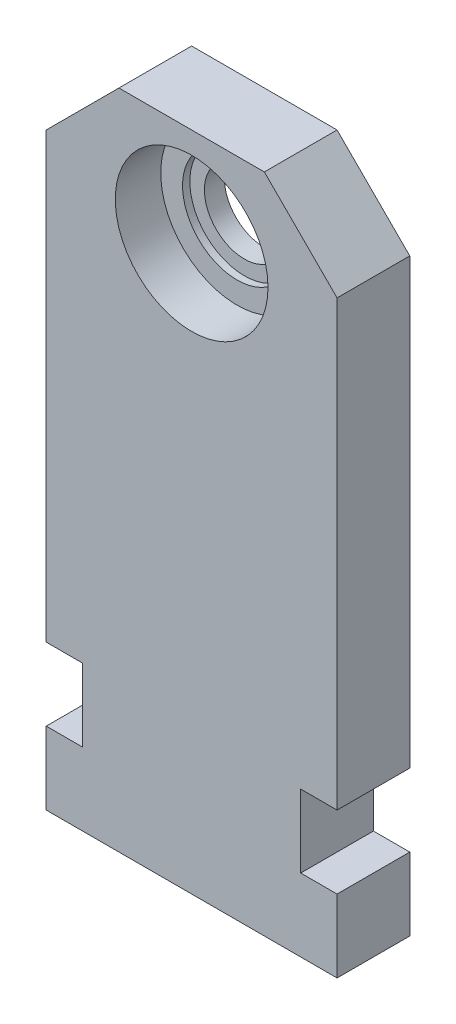
ISO-10303-21;
HEADER;
FILE_DESCRIPTION(('STEP AP214'),'2;1');
FILE_NAME('part.step','',(''),(''),'','','');
FILE_SCHEMA(('AUTOMOTIVE_DESIGN { 1 0 10303 214 1 1 1 1 }'));
ENDSEC;
DATA;
#1=APPLICATION_CONTEXT('core data for automotive mechanical design processes');
#2=APPLICATION_PROTOCOL_DEFINITION('international standard','automotive_design',2000,#1);
#3=PRODUCT_CONTEXT('',#1,'mechanical');
#4=PRODUCT('Part','Part','',(#3));
#5=PRODUCT_RELATED_PRODUCT_CATEGORY('part','',(#4));
#6=PRODUCT_DEFINITION_FORMATION('','',#4);
#7=PRODUCT_DEFINITION_CONTEXT('part definition',#1,'design');
#8=PRODUCT_DEFINITION('design','',#6,#7);
#9=PRODUCT_DEFINITION_SHAPE('','',#8);
#10=(LENGTH_UNIT() NAMED_UNIT(*) SI_UNIT(.MILLI.,.METRE.));
#11=(NAMED_UNIT(*) PLANE_ANGLE_UNIT() SI_UNIT($,.RADIAN.));
#12=(NAMED_UNIT(*) SI_UNIT($,.STERADIAN.) SOLID_ANGLE_UNIT());
#13=UNCERTAINTY_MEASURE_WITH_UNIT(LENGTH_MEASURE(1.E-05),#10,'distance_accuracy_value','');
#14=(GEOMETRIC_REPRESENTATION_CONTEXT(3) GLOBAL_UNCERTAINTY_ASSIGNED_CONTEXT((#13)) GLOBAL_UNIT_ASSIGNED_CONTEXT((#10,
#11,#12)) REPRESENTATION_CONTEXT('',''));
#15=CARTESIAN_POINT('',(0.,0.,0.));
#16=DIRECTION('',(0.,0.,1.));
#17=DIRECTION('',(1.,0.,0.));
#18=AXIS2_PLACEMENT_3D('',#15,#16,#17);
#19=CARTESIAN_POINT('',(0.,0.,20.));
#20=DIRECTION('',(1.,0.,0.));
#21=DIRECTION('',(0.,0.,-1.));
#22=AXIS2_PLACEMENT_3D('',#19,#20,#21);
#23=PLANE('',#22);
#24=DIRECTION('',(0.,-1.,0.));
#25=VECTOR('',#24,1.);
#26=CARTESIAN_POINT('',(0.,0.,20.));
#27=LINE('',#26,#25);
#28=CARTESIAN_POINT('',(0.,20.,20.));
#29=VERTEX_POINT('',#28);
#30=CARTESIAN_POINT('',(0.,0.,20.));
#31=VERTEX_POINT('',#30);
#32=EDGE_CURVE('E171',#29,#31,#27,.T.);
#33=ORIENTED_EDGE('',*,*,#32,.F.);
#34=DIRECTION('',(0.,0.,1.));
#35=VECTOR('',#34,1.);
#36=CARTESIAN_POINT('',(0.,20.,0.));
#37=LINE('',#36,#35);
#38=CARTESIAN_POINT('',(0.,20.,0.));
#39=VERTEX_POINT('',#38);
#40=EDGE_CURVE('E143',#39,#29,#37,.T.);
#41=ORIENTED_EDGE('',*,*,#40,.F.);
#42=DIRECTION('',(0.,-1.,0.));
#43=VECTOR('',#42,1.);
#44=CARTESIAN_POINT('',(0.,0.,0.));
#45=LINE('',#44,#43);
#46=CARTESIAN_POINT('',(0.,0.,0.));
#47=VERTEX_POINT('',#46);
#48=EDGE_CURVE('E244',#39,#47,#45,.T.);
#49=ORIENTED_EDGE('',*,*,#48,.T.);
#50=DIRECTION('',(0.,0.,-1.));
#51=VECTOR('',#50,1.);
#52=CARTESIAN_POINT('',(0.,0.,20.));
#53=LINE('',#52,#51);
#54=EDGE_CURVE('E175',#31,#47,#53,.T.);
#55=ORIENTED_EDGE('',*,*,#54,.F.);
#56=EDGE_LOOP('',(#33,#41,#49,#55));
#57=FACE_BOUND('',#56,.T.);
#58=ADVANCED_FACE('F32',(#57),#23,.F.);
#59=CARTESIAN_POINT('',(80.,0.,20.));
#60=DIRECTION('',(-1.,0.,0.));
#61=DIRECTION('',(0.,0.,1.));
#62=AXIS2_PLACEMENT_3D('',#59,#60,#61);
#63=PLANE('',#62);
#64=DIRECTION('',(0.,1.,0.));
#65=VECTOR('',#64,1.);
#66=CARTESIAN_POINT('',(80.,0.,0.));
#67=LINE('',#66,#65);
#68=CARTESIAN_POINT('',(80.,0.,0.));
#69=VERTEX_POINT('',#68);
#70=CARTESIAN_POINT('',(80.,20.,0.));
#71=VERTEX_POINT('',#70);
#72=EDGE_CURVE('E160',#69,#71,#67,.T.);
#73=ORIENTED_EDGE('',*,*,#72,.T.);
#74=DIRECTION('',(0.,0.,1.));
#75=VECTOR('',#74,1.);
#76=CARTESIAN_POINT('',(80.,20.,0.));
#77=LINE('',#76,#75);
#78=CARTESIAN_POINT('',(80.,20.,20.));
#79=VERTEX_POINT('',#78);
#80=EDGE_CURVE('E283',#71,#79,#77,.T.);
#81=ORIENTED_EDGE('',*,*,#80,.T.);
#82=DIRECTION('',(0.,1.,0.));
#83=VECTOR('',#82,1.);
#84=CARTESIAN_POINT('',(80.,0.,20.));
#85=LINE('',#84,#83);
#86=CARTESIAN_POINT('',(80.,0.,20.));
#87=VERTEX_POINT('',#86);
#88=EDGE_CURVE('E203',#87,#79,#85,.T.);
#89=ORIENTED_EDGE('',*,*,#88,.F.);
#90=DIRECTION('',(0.,0.,-1.));
#91=VECTOR('',#90,1.);
#92=CARTESIAN_POINT('',(80.,0.,20.));
#93=LINE('',#92,#91);
#94=EDGE_CURVE('E172',#87,#69,#93,.T.);
#95=ORIENTED_EDGE('',*,*,#94,.T.);
#96=EDGE_LOOP('',(#73,#81,#89,#95));
#97=FACE_BOUND('',#96,.T.);
#98=ADVANCED_FACE('F216',(#97),#63,.F.);
#99=CARTESIAN_POINT('',(40.,155.,0.));
#100=DIRECTION('',(0.,0.,1.));
#101=DIRECTION('',(1.,0.,0.));
#102=AXIS2_PLACEMENT_3D('',#99,#100,#101);
#103=CYLINDRICAL_SURFACE('',#102,11.);
#104=CARTESIAN_POINT('',(40.,155.,0.));
#105=DIRECTION('',(0.,0.,1.));
#106=DIRECTION('',(1.,0.,0.));
#107=AXIS2_PLACEMENT_3D('',#104,#105,#106);
#108=CIRCLE('',#107,11.);
#109=CARTESIAN_POINT('',(51.,155.,0.));
#110=VERTEX_POINT('',#109);
#111=EDGE_CURVE('E245',#110,#110,#108,.T.);
#112=ORIENTED_EDGE('',*,*,#111,.F.);
#113=EDGE_LOOP('',(#112));
#114=FACE_BOUND('',#113,.T.);
#115=CARTESIAN_POINT('',(40.,155.,5.5));
#116=DIRECTION('',(0.,0.,1.));
#117=DIRECTION('',(1.,0.,0.));
#118=AXIS2_PLACEMENT_3D('',#115,#116,#117);
#119=CIRCLE('',#118,11.);
#120=CARTESIAN_POINT('',(51.,155.,5.5));
#121=VERTEX_POINT('',#120);
#122=EDGE_CURVE('E36',#121,#121,#119,.F.);
#123=ORIENTED_EDGE('',*,*,#122,.F.);
#124=EDGE_LOOP('',(#123));
#125=FACE_BOUND('',#124,.T.);
#126=ADVANCED_FACE('F222',(#114,#125),#103,.F.);
#127=CARTESIAN_POINT('',(0.,162.,0.));
#128=VERTEX_POINT('',#127);
#129=CARTESIAN_POINT('',(0.,40.,0.));
#130=VERTEX_POINT('',#129);
#131=EDGE_CURVE('E165',#128,#130,#45,.T.);
#132=ORIENTED_EDGE('',*,*,#131,.T.);
#133=DIRECTION('',(0.,0.,1.));
#134=VECTOR('',#133,1.);
#135=CARTESIAN_POINT('',(0.,40.,0.));
#136=LINE('',#135,#134);
#137=CARTESIAN_POINT('',(0.,40.,20.));
#138=VERTEX_POINT('',#137);
#139=EDGE_CURVE('E241',#130,#138,#136,.T.);
#140=ORIENTED_EDGE('',*,*,#139,.T.);
#141=CARTESIAN_POINT('',(0.,162.,20.));
#142=VERTEX_POINT('',#141);
#143=EDGE_CURVE('E250',#142,#138,#27,.T.);
#144=ORIENTED_EDGE('',*,*,#143,.F.);
#145=DIRECTION('',(0.,0.,-1.));
#146=VECTOR('',#145,1.);
#147=CARTESIAN_POINT('',(0.,162.,20.));
#148=LINE('',#147,#146);
#149=EDGE_CURVE('E11',#142,#128,#148,.T.);
#150=ORIENTED_EDGE('',*,*,#149,.T.);
#151=EDGE_LOOP('',(#132,#140,#144,#150));
#152=FACE_BOUND('',#151,.T.);
#153=ADVANCED_FACE('F218',(#152),#23,.F.);
#154=CARTESIAN_POINT('',(0.,0.,20.));
#155=DIRECTION('',(0.,1.,0.));
#156=DIRECTION('',(0.,0.,1.));
#157=AXIS2_PLACEMENT_3D('',#154,#155,#156);
#158=PLANE('',#157);
#159=DIRECTION('',(1.,0.,0.));
#160=VECTOR('',#159,1.);
#161=CARTESIAN_POINT('',(0.,0.,0.));
#162=LINE('',#161,#160);
#163=EDGE_CURVE('E161',#47,#69,#162,.T.);
#164=ORIENTED_EDGE('',*,*,#163,.T.);
#165=ORIENTED_EDGE('',*,*,#94,.F.);
#166=DIRECTION('',(1.,0.,0.));
#167=VECTOR('',#166,1.);
#168=CARTESIAN_POINT('',(0.,0.,20.));
#169=LINE('',#168,#167);
#170=EDGE_CURVE('E248',#31,#87,#169,.T.);
#171=ORIENTED_EDGE('',*,*,#170,.F.);
#172=ORIENTED_EDGE('',*,*,#54,.T.);
#173=EDGE_LOOP('',(#164,#165,#171,#172));
#174=FACE_BOUND('',#173,.T.);
#175=ADVANCED_FACE('F228',(#174),#158,.F.);
#176=CARTESIAN_POINT('',(80.,40.,20.));
#177=VERTEX_POINT('',#176);
#178=CARTESIAN_POINT('',(80.,162.,20.));
#179=VERTEX_POINT('',#178);
#180=EDGE_CURVE('E151',#177,#179,#85,.T.);
#181=ORIENTED_EDGE('',*,*,#180,.F.);
#182=DIRECTION('',(0.,0.,1.));
#183=VECTOR('',#182,1.);
#184=CARTESIAN_POINT('',(80.,40.,0.));
#185=LINE('',#184,#183);
#186=CARTESIAN_POINT('',(80.,40.,0.));
#187=VERTEX_POINT('',#186);
#188=EDGE_CURVE('E138',#187,#177,#185,.T.);
#189=ORIENTED_EDGE('',*,*,#188,.F.);
#190=CARTESIAN_POINT('',(80.,162.,0.));
#191=VERTEX_POINT('',#190);
#192=EDGE_CURVE('E149',#187,#191,#67,.T.);
#193=ORIENTED_EDGE('',*,*,#192,.T.);
#194=DIRECTION('',(0.,0.,1.));
#195=VECTOR('',#194,1.);
#196=CARTESIAN_POINT('',(80.,162.,20.));
#197=LINE('',#196,#195);
#198=EDGE_CURVE('E187',#191,#179,#197,.T.);
#199=ORIENTED_EDGE('',*,*,#198,.T.);
#200=EDGE_LOOP('',(#181,#189,#193,#199));
#201=FACE_BOUND('',#200,.T.);
#202=ADVANCED_FACE('F147',(#201),#63,.F.);
#203=CARTESIAN_POINT('',(0.,182.,20.));
#204=DIRECTION('',(0.,-1.,0.));
#205=DIRECTION('',(0.,0.,-1.));
#206=AXIS2_PLACEMENT_3D('',#203,#204,#205);
#207=PLANE('',#206);
#208=DIRECTION('',(-1.,0.,0.));
#209=VECTOR('',#208,1.);
#210=CARTESIAN_POINT('',(0.,182.,20.));
#211=LINE('',#210,#209);
#212=CARTESIAN_POINT('',(60.,182.,20.));
#213=VERTEX_POINT('',#212);
#214=CARTESIAN_POINT('',(20.0000000000001,182.,20.));
#215=VERTEX_POINT('',#214);
#216=EDGE_CURVE('E176',#213,#215,#211,.T.);
#217=ORIENTED_EDGE('',*,*,#216,.F.);
#218=DIRECTION('',(0.,0.,-1.));
#219=VECTOR('',#218,1.);
#220=CARTESIAN_POINT('',(60.,182.,20.));
#221=LINE('',#220,#219);
#222=CARTESIAN_POINT('',(60.,182.,0.));
#223=VERTEX_POINT('',#222);
#224=EDGE_CURVE('E181',#213,#223,#221,.T.);
#225=ORIENTED_EDGE('',*,*,#224,.T.);
#226=DIRECTION('',(-1.,0.,0.));
#227=VECTOR('',#226,1.);
#228=CARTESIAN_POINT('',(0.,182.,0.));
#229=LINE('',#228,#227);
#230=CARTESIAN_POINT('',(20.0000000000001,182.,0.));
#231=VERTEX_POINT('',#230);
#232=EDGE_CURVE('E164',#223,#231,#229,.T.);
#233=ORIENTED_EDGE('',*,*,#232,.T.);
#234=DIRECTION('',(0.,0.,1.));
#235=VECTOR('',#234,1.);
#236=CARTESIAN_POINT('',(20.0000000000001,182.,20.));
#237=LINE('',#236,#235);
#238=EDGE_CURVE('E179',#231,#215,#237,.T.);
#239=ORIENTED_EDGE('',*,*,#238,.T.);
#240=EDGE_LOOP('',(#217,#225,#233,#239));
#241=FACE_BOUND('',#240,.T.);
#242=ADVANCED_FACE('F201',(#241),#207,.F.);
#243=CARTESIAN_POINT('',(0.,0.,20.));
#244=DIRECTION('',(0.,0.,-1.));
#245=DIRECTION('',(-1.,0.,0.));
#246=AXIS2_PLACEMENT_3D('',#243,#244,#245);
#247=PLANE('',#246);
#248=CARTESIAN_POINT('',(40.,155.,20.));
#249=DIRECTION('',(0.,0.,1.));
#250=DIRECTION('',(1.,0.,0.));
#251=AXIS2_PLACEMENT_3D('',#248,#249,#250);
#252=CIRCLE('',#251,21.);
#253=CARTESIAN_POINT('',(61.,155.,20.));
#254=VERTEX_POINT('',#253);
#255=EDGE_CURVE('E255',#254,#254,#252,.T.);
#256=ORIENTED_EDGE('',*,*,#255,.F.);
#257=EDGE_LOOP('',(#256));
#258=FACE_BOUND('',#257,.T.);
#259=ORIENTED_EDGE('',*,*,#88,.T.);
#260=DIRECTION('',(-1.,0.,0.));
#261=VECTOR('',#260,1.);
#262=CARTESIAN_POINT('',(0.,20.,20.));
#263=LINE('',#262,#261);
#264=CARTESIAN_POINT('',(70.,20.,20.));
#265=VERTEX_POINT('',#264);
#266=EDGE_CURVE('E264',#79,#265,#263,.T.);
#267=ORIENTED_EDGE('',*,*,#266,.T.);
#268=DIRECTION('',(0.,1.,0.));
#269=VECTOR('',#268,1.);
#270=CARTESIAN_POINT('',(70.,0.,20.));
#271=LINE('',#270,#269);
#272=CARTESIAN_POINT('',(70.,40.,20.));
#273=VERTEX_POINT('',#272);
#274=EDGE_CURVE('E269',#265,#273,#271,.T.);
#275=ORIENTED_EDGE('',*,*,#274,.T.);
#276=DIRECTION('',(1.,0.,0.));
#277=VECTOR('',#276,1.);
#278=CARTESIAN_POINT('',(0.,40.,20.));
#279=LINE('',#278,#277);
#280=EDGE_CURVE('E272',#273,#177,#279,.T.);
#281=ORIENTED_EDGE('',*,*,#280,.T.);
#282=ORIENTED_EDGE('',*,*,#180,.T.);
#283=DIRECTION('',(0.707106781186547,-0.707106781186549,0.));
#284=VECTOR('',#283,1.);
#285=CARTESIAN_POINT('',(60.,182.,20.));
#286=LINE('',#285,#284);
#287=EDGE_CURVE('E41',#179,#213,#286,.F.);
#288=ORIENTED_EDGE('',*,*,#287,.T.);
#289=ORIENTED_EDGE('',*,*,#216,.T.);
#290=DIRECTION('',(0.707106781186549,0.707106781186546,0.));
#291=VECTOR('',#290,1.);
#292=CARTESIAN_POINT('',(0.,162.,20.));
#293=LINE('',#292,#291);
#294=EDGE_CURVE('E189',#215,#142,#293,.F.);
#295=ORIENTED_EDGE('',*,*,#294,.T.);
#296=ORIENTED_EDGE('',*,*,#143,.T.);
#297=DIRECTION('',(1.,0.,0.));
#298=VECTOR('',#297,1.);
#299=CARTESIAN_POINT('',(0.,40.,20.));
#300=LINE('',#299,#298);
#301=CARTESIAN_POINT('',(9.99999999999999,40.,20.));
#302=VERTEX_POINT('',#301);
#303=EDGE_CURVE('E277',#138,#302,#300,.T.);
#304=ORIENTED_EDGE('',*,*,#303,.T.);
#305=DIRECTION('',(0.,-1.,0.));
#306=VECTOR('',#305,1.);
#307=CARTESIAN_POINT('',(9.99999999999999,0.,20.));
#308=LINE('',#307,#306);
#309=CARTESIAN_POINT('',(9.99999999999999,20.,20.));
#310=VERTEX_POINT('',#309);
#311=EDGE_CURVE('E280',#302,#310,#308,.T.);
#312=ORIENTED_EDGE('',*,*,#311,.T.);
#313=DIRECTION('',(-1.,0.,0.));
#314=VECTOR('',#313,1.);
#315=CARTESIAN_POINT('',(0.,20.,20.));
#316=LINE('',#315,#314);
#317=EDGE_CURVE('E274',#310,#29,#316,.T.);
#318=ORIENTED_EDGE('',*,*,#317,.T.);
#319=ORIENTED_EDGE('',*,*,#32,.T.);
#320=ORIENTED_EDGE('',*,*,#170,.T.);
#321=EDGE_LOOP('',(#259,#267,#275,#281,#282,#288,#289,#295,#296,#304,#312,#318,#319,#320));
#322=FACE_BOUND('',#321,.T.);
#323=ADVANCED_FACE('F196',(#258,#322),#247,.F.);
#324=CARTESIAN_POINT('',(0.,0.,0.));
#325=DIRECTION('',(0.,0.,-1.));
#326=DIRECTION('',(-1.,0.,0.));
#327=AXIS2_PLACEMENT_3D('',#324,#325,#326);
#328=PLANE('',#327);
#329=DIRECTION('',(1.,0.,0.));
#330=VECTOR('',#329,1.);
#331=CARTESIAN_POINT('',(80.,20.,0.));
#332=LINE('',#331,#330);
#333=CARTESIAN_POINT('',(70.,20.,0.));
#334=VERTEX_POINT('',#333);
#335=EDGE_CURVE('E152',#334,#71,#332,.T.);
#336=ORIENTED_EDGE('',*,*,#335,.T.);
#337=ORIENTED_EDGE('',*,*,#72,.F.);
#338=ORIENTED_EDGE('',*,*,#163,.F.);
#339=ORIENTED_EDGE('',*,*,#48,.F.);
#340=DIRECTION('',(1.,0.,0.));
#341=VECTOR('',#340,1.);
#342=CARTESIAN_POINT('',(0.,20.,0.));
#343=LINE('',#342,#341);
#344=CARTESIAN_POINT('',(9.99999999999999,20.,0.));
#345=VERTEX_POINT('',#344);
#346=EDGE_CURVE('E295',#39,#345,#343,.T.);
#347=ORIENTED_EDGE('',*,*,#346,.T.);
#348=DIRECTION('',(0.,1.,0.));
#349=VECTOR('',#348,1.);
#350=CARTESIAN_POINT('',(9.99999999999999,20.,0.));
#351=LINE('',#350,#349);
#352=CARTESIAN_POINT('',(9.99999999999999,40.,0.));
#353=VERTEX_POINT('',#352);
#354=EDGE_CURVE('E292',#345,#353,#351,.T.);
#355=ORIENTED_EDGE('',*,*,#354,.T.);
#356=DIRECTION('',(-1.,0.,0.));
#357=VECTOR('',#356,1.);
#358=CARTESIAN_POINT('',(0.,40.,0.));
#359=LINE('',#358,#357);
#360=EDGE_CURVE('E56',#353,#130,#359,.T.);
#361=ORIENTED_EDGE('',*,*,#360,.T.);
#362=ORIENTED_EDGE('',*,*,#131,.F.);
#363=DIRECTION('',(-0.707106781186549,-0.707106781186546,0.));
#364=VECTOR('',#363,1.);
#365=CARTESIAN_POINT('',(-81.,81.0000000000004,0.));
#366=LINE('',#365,#364);
#367=EDGE_CURVE('E184',#128,#231,#366,.F.);
#368=ORIENTED_EDGE('',*,*,#367,.T.);
#369=ORIENTED_EDGE('',*,*,#232,.F.);
#370=DIRECTION('',(-0.707106781186547,0.707106781186549,0.));
#371=VECTOR('',#370,1.);
#372=CARTESIAN_POINT('',(121.,121.,0.));
#373=LINE('',#372,#371);
#374=EDGE_CURVE('E158',#223,#191,#373,.F.);
#375=ORIENTED_EDGE('',*,*,#374,.T.);
#376=ORIENTED_EDGE('',*,*,#192,.F.);
#377=DIRECTION('',(-1.,0.,0.));
#378=VECTOR('',#377,1.);
#379=CARTESIAN_POINT('',(80.,40.,0.));
#380=LINE('',#379,#378);
#381=CARTESIAN_POINT('',(70.,40.,0.));
#382=VERTEX_POINT('',#381);
#383=EDGE_CURVE('E135',#187,#382,#380,.T.);
#384=ORIENTED_EDGE('',*,*,#383,.T.);
#385=DIRECTION('',(0.,-1.,0.));
#386=VECTOR('',#385,1.);
#387=CARTESIAN_POINT('',(70.,20.,0.));
#388=LINE('',#387,#386);
#389=EDGE_CURVE('E48',#382,#334,#388,.T.);
#390=ORIENTED_EDGE('',*,*,#389,.T.);
#391=EDGE_LOOP('',(#336,#337,#338,#339,#347,#355,#361,#362,#368,#369,#375,#376,#384,#390));
#392=FACE_BOUND('',#391,.T.);
#393=ORIENTED_EDGE('',*,*,#111,.T.);
#394=EDGE_LOOP('',(#393));
#395=FACE_BOUND('',#394,.T.);
#396=ADVANCED_FACE('F155',(#392,#395),#328,.T.);
#397=CARTESIAN_POINT('',(60.,182.,20.));
#398=DIRECTION('',(-0.707106781186549,-0.707106781186547,0.));
#399=DIRECTION('',(0.,0.,-1.));
#400=AXIS2_PLACEMENT_3D('',#397,#398,#399);
#401=PLANE('',#400);
#402=ORIENTED_EDGE('',*,*,#287,.F.);
#403=ORIENTED_EDGE('',*,*,#198,.F.);
#404=ORIENTED_EDGE('',*,*,#374,.F.);
#405=ORIENTED_EDGE('',*,*,#224,.F.);
#406=EDGE_LOOP('',(#402,#403,#404,#405));
#407=FACE_BOUND('',#406,.T.);
#408=ADVANCED_FACE('F205',(#407),#401,.F.);
#409=CARTESIAN_POINT('',(0.,162.,20.));
#410=DIRECTION('',(0.707106781186546,-0.707106781186549,0.));
#411=DIRECTION('',(0.,0.,-1.));
#412=AXIS2_PLACEMENT_3D('',#409,#410,#411);
#413=PLANE('',#412);
#414=ORIENTED_EDGE('',*,*,#294,.F.);
#415=ORIENTED_EDGE('',*,*,#238,.F.);
#416=ORIENTED_EDGE('',*,*,#367,.F.);
#417=ORIENTED_EDGE('',*,*,#149,.F.);
#418=EDGE_LOOP('',(#414,#415,#416,#417));
#419=FACE_BOUND('',#418,.T.);
#420=ADVANCED_FACE('F34',(#419),#413,.F.);
#421=CARTESIAN_POINT('',(40.,155.,7.5));
#422=DIRECTION('',(0.,0.,1.));
#423=DIRECTION('',(1.,0.,0.));
#424=AXIS2_PLACEMENT_3D('',#421,#422,#423);
#425=PLANE('',#424);
#426=CARTESIAN_POINT('',(40.,155.,7.5));
#427=DIRECTION('',(0.,0.,1.));
#428=DIRECTION('',(1.,0.,0.));
#429=AXIS2_PLACEMENT_3D('',#426,#427,#428);
#430=CIRCLE('',#429,15.);
#431=CARTESIAN_POINT('',(55.,155.,7.5));
#432=VERTEX_POINT('',#431);
#433=EDGE_CURVE('E260',#432,#432,#430,.T.);
#434=ORIENTED_EDGE('',*,*,#433,.F.);
#435=EDGE_LOOP('',(#434));
#436=FACE_BOUND('',#435,.T.);
#437=CARTESIAN_POINT('',(40.,155.,7.5));
#438=DIRECTION('',(0.,0.,1.));
#439=DIRECTION('',(1.,0.,0.));
#440=AXIS2_PLACEMENT_3D('',#437,#438,#439);
#441=CIRCLE('',#440,21.);
#442=CARTESIAN_POINT('',(61.,155.,7.5));
#443=VERTEX_POINT('',#442);
#444=EDGE_CURVE('E254',#443,#443,#441,.T.);
#445=ORIENTED_EDGE('',*,*,#444,.T.);
#446=EDGE_LOOP('',(#445));
#447=FACE_BOUND('',#446,.T.);
#448=ADVANCED_FACE('F211',(#436,#447),#425,.T.);
#449=CARTESIAN_POINT('',(40.,155.,7.5));
#450=DIRECTION('',(0.,0.,1.));
#451=DIRECTION('',(1.,0.,0.));
#452=AXIS2_PLACEMENT_3D('',#449,#450,#451);
#453=CYLINDRICAL_SURFACE('',#452,21.);
#454=ORIENTED_EDGE('',*,*,#444,.F.);
#455=EDGE_LOOP('',(#454));
#456=FACE_BOUND('',#455,.T.);
#457=ORIENTED_EDGE('',*,*,#255,.T.);
#458=EDGE_LOOP('',(#457));
#459=FACE_BOUND('',#458,.T.);
#460=ADVANCED_FACE('F337',(#456,#459),#453,.F.);
#461=CARTESIAN_POINT('',(40.,155.,5.5));
#462=DIRECTION('',(0.,0.,1.));
#463=DIRECTION('',(1.,0.,0.));
#464=AXIS2_PLACEMENT_3D('',#461,#462,#463);
#465=PLANE('',#464);
#466=CARTESIAN_POINT('',(40.,155.,5.5));
#467=DIRECTION('',(0.,0.,1.));
#468=DIRECTION('',(1.,0.,0.));
#469=AXIS2_PLACEMENT_3D('',#466,#467,#468);
#470=CIRCLE('',#469,15.);
#471=CARTESIAN_POINT('',(55.,155.,5.5));
#472=VERTEX_POINT('',#471);
#473=EDGE_CURVE('E263',#472,#472,#470,.T.);
#474=ORIENTED_EDGE('',*,*,#473,.T.);
#475=EDGE_LOOP('',(#474));
#476=FACE_BOUND('',#475,.T.);
#477=ORIENTED_EDGE('',*,*,#122,.T.);
#478=EDGE_LOOP('',(#477));
#479=FACE_BOUND('',#478,.T.);
#480=ADVANCED_FACE('F334',(#476,#479),#465,.T.);
#481=CARTESIAN_POINT('',(40.,155.,5.5));
#482=DIRECTION('',(0.,0.,1.));
#483=DIRECTION('',(1.,0.,0.));
#484=AXIS2_PLACEMENT_3D('',#481,#482,#483);
#485=CYLINDRICAL_SURFACE('',#484,15.);
#486=ORIENTED_EDGE('',*,*,#473,.F.);
#487=EDGE_LOOP('',(#486));
#488=FACE_BOUND('',#487,.T.);
#489=ORIENTED_EDGE('',*,*,#433,.T.);
#490=EDGE_LOOP('',(#489));
#491=FACE_BOUND('',#490,.T.);
#492=ADVANCED_FACE('F329',(#488,#491),#485,.F.);
#493=CARTESIAN_POINT('',(0.,20.,0.));
#494=DIRECTION('',(0.,-1.,0.));
#495=DIRECTION('',(0.,0.,-1.));
#496=AXIS2_PLACEMENT_3D('',#493,#494,#495);
#497=PLANE('',#496);
#498=DIRECTION('',(0.,0.,1.));
#499=VECTOR('',#498,1.);
#500=CARTESIAN_POINT('',(9.99999999999999,20.,0.));
#501=LINE('',#500,#499);
#502=EDGE_CURVE('E284',#345,#310,#501,.T.);
#503=ORIENTED_EDGE('',*,*,#502,.F.);
#504=ORIENTED_EDGE('',*,*,#346,.F.);
#505=ORIENTED_EDGE('',*,*,#40,.T.);
#506=ORIENTED_EDGE('',*,*,#317,.F.);
#507=EDGE_LOOP('',(#503,#504,#505,#506));
#508=FACE_BOUND('',#507,.T.);
#509=ADVANCED_FACE('F316',(#508),#497,.F.);
#510=CARTESIAN_POINT('',(0.,40.,0.));
#511=DIRECTION('',(0.,1.,0.));
#512=DIRECTION('',(0.,0.,1.));
#513=AXIS2_PLACEMENT_3D('',#510,#511,#512);
#514=PLANE('',#513);
#515=ORIENTED_EDGE('',*,*,#139,.F.);
#516=ORIENTED_EDGE('',*,*,#360,.F.);
#517=DIRECTION('',(0.,0.,1.));
#518=VECTOR('',#517,1.);
#519=CARTESIAN_POINT('',(9.99999999999999,40.,0.));
#520=LINE('',#519,#518);
#521=EDGE_CURVE('E287',#353,#302,#520,.T.);
#522=ORIENTED_EDGE('',*,*,#521,.T.);
#523=ORIENTED_EDGE('',*,*,#303,.F.);
#524=EDGE_LOOP('',(#515,#516,#522,#523));
#525=FACE_BOUND('',#524,.T.);
#526=ADVANCED_FACE('F320',(#525),#514,.F.);
#527=CARTESIAN_POINT('',(9.99999999999999,20.,0.));
#528=DIRECTION('',(1.,0.,0.));
#529=DIRECTION('',(0.,0.,-1.));
#530=AXIS2_PLACEMENT_3D('',#527,#528,#529);
#531=PLANE('',#530);
#532=ORIENTED_EDGE('',*,*,#521,.F.);
#533=ORIENTED_EDGE('',*,*,#354,.F.);
#534=ORIENTED_EDGE('',*,*,#502,.T.);
#535=ORIENTED_EDGE('',*,*,#311,.F.);
#536=EDGE_LOOP('',(#532,#533,#534,#535));
#537=FACE_BOUND('',#536,.T.);
#538=ADVANCED_FACE('F318',(#537),#531,.F.);
#539=CARTESIAN_POINT('',(80.,20.,0.));
#540=DIRECTION('',(0.,-1.,0.));
#541=DIRECTION('',(0.,0.,-1.));
#542=AXIS2_PLACEMENT_3D('',#539,#540,#541);
#543=PLANE('',#542);
#544=ORIENTED_EDGE('',*,*,#80,.F.);
#545=ORIENTED_EDGE('',*,*,#335,.F.);
#546=DIRECTION('',(0.,0.,1.));
#547=VECTOR('',#546,1.);
#548=CARTESIAN_POINT('',(70.,20.,0.));
#549=LINE('',#548,#547);
#550=EDGE_CURVE('E299',#334,#265,#549,.T.);
#551=ORIENTED_EDGE('',*,*,#550,.T.);
#552=ORIENTED_EDGE('',*,*,#266,.F.);
#553=EDGE_LOOP('',(#544,#545,#551,#552));
#554=FACE_BOUND('',#553,.T.);
#555=ADVANCED_FACE('F327',(#554),#543,.F.);
#556=CARTESIAN_POINT('',(70.,20.,0.));
#557=DIRECTION('',(-1.,0.,0.));
#558=DIRECTION('',(0.,0.,1.));
#559=AXIS2_PLACEMENT_3D('',#556,#557,#558);
#560=PLANE('',#559);
#561=ORIENTED_EDGE('',*,*,#550,.F.);
#562=ORIENTED_EDGE('',*,*,#389,.F.);
#563=DIRECTION('',(0.,0.,1.));
#564=VECTOR('',#563,1.);
#565=CARTESIAN_POINT('',(70.,40.,0.));
#566=LINE('',#565,#564);
#567=EDGE_CURVE('E140',#382,#273,#566,.T.);
#568=ORIENTED_EDGE('',*,*,#567,.T.);
#569=ORIENTED_EDGE('',*,*,#274,.F.);
#570=EDGE_LOOP('',(#561,#562,#568,#569));
#571=FACE_BOUND('',#570,.T.);
#572=ADVANCED_FACE('F396',(#571),#560,.F.);
#573=CARTESIAN_POINT('',(80.,40.,0.));
#574=DIRECTION('',(0.,1.,0.));
#575=DIRECTION('',(0.,0.,1.));
#576=AXIS2_PLACEMENT_3D('',#573,#574,#575);
#577=PLANE('',#576);
#578=ORIENTED_EDGE('',*,*,#567,.F.);
#579=ORIENTED_EDGE('',*,*,#383,.F.);
#580=ORIENTED_EDGE('',*,*,#188,.T.);
#581=ORIENTED_EDGE('',*,*,#280,.F.);
#582=EDGE_LOOP('',(#578,#579,#580,#581));
#583=FACE_BOUND('',#582,.T.);
#584=ADVANCED_FACE('F137',(#583),#577,.F.);
#585=CLOSED_SHELL('',(#58,#98,#126,#153,#175,#202,#242,#323,#396,#408,#420,#448,#460,#480,#492,
#509,#526,#538,#555,#572,#584));
#586=MANIFOLD_SOLID_BREP('B2',#585);
#587=ADVANCED_BREP_SHAPE_REPRESENTATION('',(#18,#586),#14);
#588=SHAPE_DEFINITION_REPRESENTATION(#9,#587);
ENDSEC;
END-ISO-10303-21;
